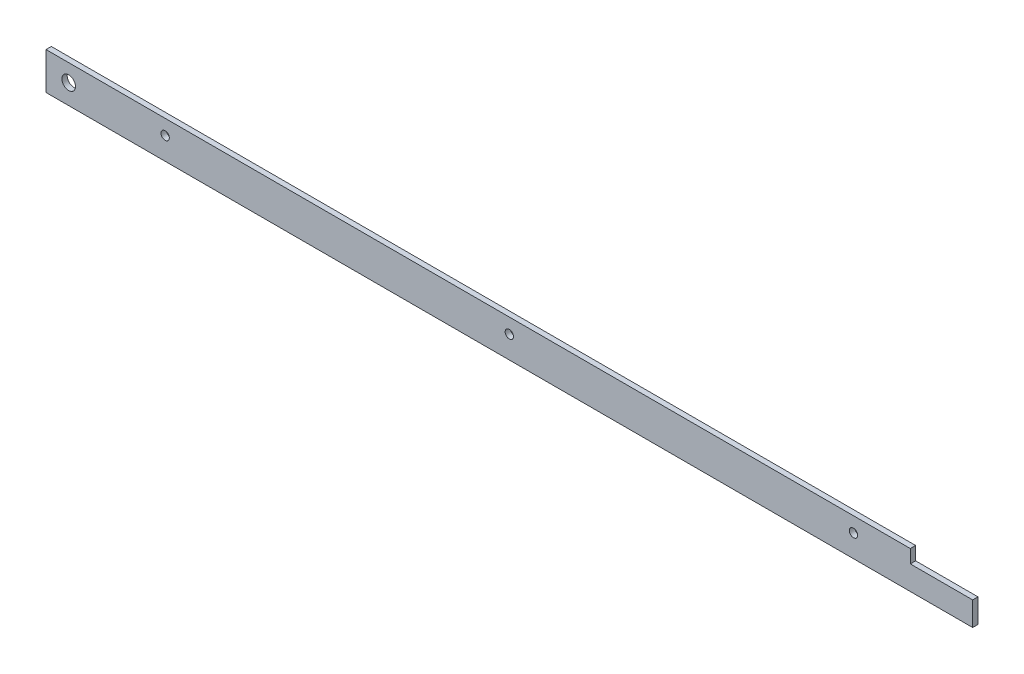
ISO-10303-21;
HEADER;
FILE_DESCRIPTION(('STEP AP214'),'2;1');
FILE_NAME('part.step','',(''),(''),'','','');
FILE_SCHEMA(('AUTOMOTIVE_DESIGN { 1 0 10303 214 1 1 1 1 }'));
ENDSEC;
DATA;
#1=APPLICATION_CONTEXT('core data for automotive mechanical design processes');
#2=APPLICATION_PROTOCOL_DEFINITION('international standard','automotive_design',2000,#1);
#3=PRODUCT_CONTEXT('',#1,'mechanical');
#4=PRODUCT('Part','Part','',(#3));
#5=PRODUCT_RELATED_PRODUCT_CATEGORY('part','',(#4));
#6=PRODUCT_DEFINITION_FORMATION('','',#4);
#7=PRODUCT_DEFINITION_CONTEXT('part definition',#1,'design');
#8=PRODUCT_DEFINITION('design','',#6,#7);
#9=PRODUCT_DEFINITION_SHAPE('','',#8);
#10=(LENGTH_UNIT() NAMED_UNIT(*) SI_UNIT(.MILLI.,.METRE.));
#11=(NAMED_UNIT(*) PLANE_ANGLE_UNIT() SI_UNIT($,.RADIAN.));
#12=(NAMED_UNIT(*) SI_UNIT($,.STERADIAN.) SOLID_ANGLE_UNIT());
#13=UNCERTAINTY_MEASURE_WITH_UNIT(LENGTH_MEASURE(1.E-05),#10,'distance_accuracy_value','');
#14=(GEOMETRIC_REPRESENTATION_CONTEXT(3) GLOBAL_UNCERTAINTY_ASSIGNED_CONTEXT((#13)) GLOBAL_UNIT_ASSIGNED_CONTEXT((#10,
#11,#12)) REPRESENTATION_CONTEXT('',''));
#15=CARTESIAN_POINT('',(0.,0.,0.));
#16=DIRECTION('',(0.,0.,1.));
#17=DIRECTION('',(1.,0.,0.));
#18=AXIS2_PLACEMENT_3D('',#15,#16,#17);
#19=CARTESIAN_POINT('',(0.,9.44698802890072,-3.175));
#20=DIRECTION('',(0.,1.,0.));
#21=DIRECTION('',(0.,0.,-1.));
#22=AXIS2_PLACEMENT_3D('',#19,#20,#21);
#23=PLANE('',#22);
#24=DIRECTION('',(1.,0.,0.));
#25=VECTOR('',#24,1.);
#26=CARTESIAN_POINT('',(0.,9.44698802890072,0.));
#27=LINE('',#26,#25);
#28=CARTESIAN_POINT('',(515.860000058,9.44698802890072,0.));
#29=VERTEX_POINT('',#28);
#30=CARTESIAN_POINT('',(553.1,9.44698802890072,0.));
#31=VERTEX_POINT('',#30);
#32=EDGE_CURVE('E139',#29,#31,#27,.T.);
#33=ORIENTED_EDGE('',*,*,#32,.T.);
#34=DIRECTION('',(0.,0.,1.));
#35=VECTOR('',#34,1.);
#36=CARTESIAN_POINT('',(553.1,9.44698802890072,-3.175));
#37=LINE('',#36,#35);
#38=CARTESIAN_POINT('',(553.1,9.44698802890072,-3.175));
#39=VERTEX_POINT('',#38);
#40=EDGE_CURVE('E138',#39,#31,#37,.T.);
#41=ORIENTED_EDGE('',*,*,#40,.F.);
#42=DIRECTION('',(1.,0.,0.));
#43=VECTOR('',#42,1.);
#44=CARTESIAN_POINT('',(0.,9.44698802890072,-3.175));
#45=LINE('',#44,#43);
#46=CARTESIAN_POINT('',(515.860000058,9.44698802890072,-3.175));
#47=VERTEX_POINT('',#46);
#48=EDGE_CURVE('E164',#47,#39,#45,.T.);
#49=ORIENTED_EDGE('',*,*,#48,.F.);
#50=DIRECTION('',(0.,0.,1.));
#51=VECTOR('',#50,1.);
#52=CARTESIAN_POINT('',(515.860000058,9.44698802890072,-3.175));
#53=LINE('',#52,#51);
#54=EDGE_CURVE('E11',#47,#29,#53,.T.);
#55=ORIENTED_EDGE('',*,*,#54,.T.);
#56=EDGE_LOOP('',(#33,#41,#49,#55));
#57=FACE_BOUND('',#56,.T.);
#58=ADVANCED_FACE('F43',(#57),#23,.T.);
#59=CARTESIAN_POINT('',(515.860000058,0.,-3.175));
#60=DIRECTION('',(-1.,0.,0.));
#61=DIRECTION('',(0.,0.,-1.));
#62=AXIS2_PLACEMENT_3D('',#59,#60,#61);
#63=PLANE('',#62);
#64=DIRECTION('',(0.,1.,0.));
#65=VECTOR('',#64,1.);
#66=CARTESIAN_POINT('',(515.860000058,0.,0.));
#67=LINE('',#66,#65);
#68=CARTESIAN_POINT('',(515.860000058,17.3919880289007,0.));
#69=VERTEX_POINT('',#68);
#70=EDGE_CURVE('E142',#29,#69,#67,.T.);
#71=ORIENTED_EDGE('',*,*,#70,.F.);
#72=ORIENTED_EDGE('',*,*,#54,.F.);
#73=DIRECTION('',(0.,1.,0.));
#74=VECTOR('',#73,1.);
#75=CARTESIAN_POINT('',(515.860000058,0.,-3.175));
#76=LINE('',#75,#74);
#77=CARTESIAN_POINT('',(515.860000058,17.3919880289007,-3.175));
#78=VERTEX_POINT('',#77);
#79=EDGE_CURVE('E91',#47,#78,#76,.T.);
#80=ORIENTED_EDGE('',*,*,#79,.T.);
#81=DIRECTION('',(0.,0.,1.));
#82=VECTOR('',#81,1.);
#83=CARTESIAN_POINT('',(515.860000058,17.3919880289007,-3.175));
#84=LINE('',#83,#82);
#85=EDGE_CURVE('E51',#78,#69,#84,.T.);
#86=ORIENTED_EDGE('',*,*,#85,.T.);
#87=EDGE_LOOP('',(#71,#72,#80,#86));
#88=FACE_BOUND('',#87,.T.);
#89=ADVANCED_FACE('F170',(#88),#63,.F.);
#90=CARTESIAN_POINT('',(0.,17.3919880289006,-3.175));
#91=DIRECTION('',(0.,-1.,0.));
#92=DIRECTION('',(1.,0.,0.));
#93=AXIS2_PLACEMENT_3D('',#90,#91,#92);
#94=PLANE('',#93);
#95=DIRECTION('',(-1.,0.,0.));
#96=VECTOR('',#95,1.);
#97=CARTESIAN_POINT('',(0.,17.3919880289006,0.));
#98=LINE('',#97,#96);
#99=CARTESIAN_POINT('',(0.,17.3919880289006,0.));
#100=VERTEX_POINT('',#99);
#101=EDGE_CURVE('E145',#69,#100,#98,.T.);
#102=ORIENTED_EDGE('',*,*,#101,.F.);
#103=ORIENTED_EDGE('',*,*,#85,.F.);
#104=DIRECTION('',(-1.,0.,0.));
#105=VECTOR('',#104,1.);
#106=CARTESIAN_POINT('',(0.,17.3919880289006,-3.175));
#107=LINE('',#106,#105);
#108=CARTESIAN_POINT('',(0.,17.3919880289006,-3.175));
#109=VERTEX_POINT('',#108);
#110=EDGE_CURVE('E120',#78,#109,#107,.T.);
#111=ORIENTED_EDGE('',*,*,#110,.T.);
#112=DIRECTION('',(0.,0.,1.));
#113=VECTOR('',#112,1.);
#114=CARTESIAN_POINT('',(0.,17.3919880289006,-3.175));
#115=LINE('',#114,#113);
#116=EDGE_CURVE('E114',#109,#100,#115,.T.);
#117=ORIENTED_EDGE('',*,*,#116,.T.);
#118=EDGE_LOOP('',(#102,#103,#111,#117));
#119=FACE_BOUND('',#118,.T.);
#120=ADVANCED_FACE('F197',(#119),#94,.F.);
#121=CARTESIAN_POINT('',(0.,0.,-3.175));
#122=DIRECTION('',(-1.,0.,0.));
#123=DIRECTION('',(0.,0.,-1.));
#124=AXIS2_PLACEMENT_3D('',#121,#122,#123);
#125=PLANE('',#124);
#126=DIRECTION('',(0.,1.,0.));
#127=VECTOR('',#126,1.);
#128=CARTESIAN_POINT('',(0.,0.,0.));
#129=LINE('',#128,#127);
#130=CARTESIAN_POINT('',(0.,-4.83301197109929,0.));
#131=VERTEX_POINT('',#130);
#132=EDGE_CURVE('E148',#131,#100,#129,.T.);
#133=ORIENTED_EDGE('',*,*,#132,.T.);
#134=ORIENTED_EDGE('',*,*,#116,.F.);
#135=DIRECTION('',(0.,1.,0.));
#136=VECTOR('',#135,1.);
#137=CARTESIAN_POINT('',(0.,0.,-3.175));
#138=LINE('',#137,#136);
#139=CARTESIAN_POINT('',(0.,-4.83301197109929,-3.175));
#140=VERTEX_POINT('',#139);
#141=EDGE_CURVE('E104',#140,#109,#138,.T.);
#142=ORIENTED_EDGE('',*,*,#141,.F.);
#143=DIRECTION('',(0.,0.,1.));
#144=VECTOR('',#143,1.);
#145=CARTESIAN_POINT('',(0.,-4.83301197109929,-3.175));
#146=LINE('',#145,#144);
#147=EDGE_CURVE('E109',#140,#131,#146,.T.);
#148=ORIENTED_EDGE('',*,*,#147,.T.);
#149=EDGE_LOOP('',(#133,#134,#142,#148));
#150=FACE_BOUND('',#149,.T.);
#151=ADVANCED_FACE('F117',(#150),#125,.T.);
#152=CARTESIAN_POINT('',(0.,-4.83301197109929,-3.175));
#153=DIRECTION('',(0.,1.,0.));
#154=DIRECTION('',(0.,0.,-1.));
#155=AXIS2_PLACEMENT_3D('',#152,#153,#154);
#156=PLANE('',#155);
#157=DIRECTION('',(1.,0.,0.));
#158=VECTOR('',#157,1.);
#159=CARTESIAN_POINT('',(0.,-4.83301197109929,0.));
#160=LINE('',#159,#158);
#161=CARTESIAN_POINT('',(553.1,-4.83301197109929,0.));
#162=VERTEX_POINT('',#161);
#163=EDGE_CURVE('E111',#131,#162,#160,.T.);
#164=ORIENTED_EDGE('',*,*,#163,.F.);
#165=ORIENTED_EDGE('',*,*,#147,.F.);
#166=DIRECTION('',(1.,0.,0.));
#167=VECTOR('',#166,1.);
#168=CARTESIAN_POINT('',(0.,-4.83301197109929,-3.175));
#169=LINE('',#168,#167);
#170=CARTESIAN_POINT('',(553.1,-4.83301197109929,-3.175));
#171=VERTEX_POINT('',#170);
#172=EDGE_CURVE('E99',#140,#171,#169,.T.);
#173=ORIENTED_EDGE('',*,*,#172,.T.);
#174=DIRECTION('',(0.,0.,1.));
#175=VECTOR('',#174,1.);
#176=CARTESIAN_POINT('',(553.1,-4.83301197109929,-3.175));
#177=LINE('',#176,#175);
#178=EDGE_CURVE('E115',#171,#162,#177,.T.);
#179=ORIENTED_EDGE('',*,*,#178,.T.);
#180=EDGE_LOOP('',(#164,#165,#173,#179));
#181=FACE_BOUND('',#180,.T.);
#182=ADVANCED_FACE('F110',(#181),#156,.F.);
#183=CARTESIAN_POINT('',(481.98,8.5094880289007,-3.175));
#184=DIRECTION('',(0.,0.,1.));
#185=DIRECTION('',(-1.,0.,0.));
#186=AXIS2_PLACEMENT_3D('',#183,#184,#185);
#187=CYLINDRICAL_SURFACE('',#186,2.48920000000001);
#188=CARTESIAN_POINT('',(481.98,8.5094880289007,-3.175));
#189=DIRECTION('',(0.,0.,1.));
#190=DIRECTION('',(1.,0.,0.));
#191=AXIS2_PLACEMENT_3D('',#188,#189,#190);
#192=CIRCLE('',#191,2.48920000000001);
#193=CARTESIAN_POINT('',(484.4692,8.5094880289007,-3.175));
#194=VERTEX_POINT('',#193);
#195=EDGE_CURVE('E132',#194,#194,#192,.T.);
#196=ORIENTED_EDGE('',*,*,#195,.F.);
#197=EDGE_LOOP('',(#196));
#198=FACE_BOUND('',#197,.T.);
#199=CARTESIAN_POINT('',(481.98,8.5094880289007,0.));
#200=DIRECTION('',(0.,0.,1.));
#201=DIRECTION('',(1.,0.,0.));
#202=AXIS2_PLACEMENT_3D('',#199,#200,#201);
#203=CIRCLE('',#202,2.48920000000001);
#204=CARTESIAN_POINT('',(484.4692,8.5094880289007,0.));
#205=VERTEX_POINT('',#204);
#206=EDGE_CURVE('E158',#205,#205,#203,.T.);
#207=ORIENTED_EDGE('',*,*,#206,.T.);
#208=EDGE_LOOP('',(#207));
#209=FACE_BOUND('',#208,.T.);
#210=ADVANCED_FACE('F205',(#198,#209),#187,.F.);
#211=CARTESIAN_POINT('',(276.55,8.5094880289007,-3.175));
#212=DIRECTION('',(0.,0.,1.));
#213=DIRECTION('',(-1.,0.,0.));
#214=AXIS2_PLACEMENT_3D('',#211,#212,#213);
#215=CYLINDRICAL_SURFACE('',#214,2.48920000000001);
#216=CARTESIAN_POINT('',(276.55,8.5094880289007,-3.175));
#217=DIRECTION('',(0.,0.,1.));
#218=DIRECTION('',(1.,0.,0.));
#219=AXIS2_PLACEMENT_3D('',#216,#217,#218);
#220=CIRCLE('',#219,2.48920000000001);
#221=CARTESIAN_POINT('',(279.0392,8.5094880289007,-3.175));
#222=VERTEX_POINT('',#221);
#223=EDGE_CURVE('E129',#222,#222,#220,.T.);
#224=ORIENTED_EDGE('',*,*,#223,.F.);
#225=EDGE_LOOP('',(#224));
#226=FACE_BOUND('',#225,.T.);
#227=CARTESIAN_POINT('',(276.55,8.5094880289007,0.));
#228=DIRECTION('',(0.,0.,1.));
#229=DIRECTION('',(1.,0.,0.));
#230=AXIS2_PLACEMENT_3D('',#227,#228,#229);
#231=CIRCLE('',#230,2.48920000000001);
#232=CARTESIAN_POINT('',(279.0392,8.5094880289007,0.));
#233=VERTEX_POINT('',#232);
#234=EDGE_CURVE('E155',#233,#233,#231,.T.);
#235=ORIENTED_EDGE('',*,*,#234,.T.);
#236=EDGE_LOOP('',(#235));
#237=FACE_BOUND('',#236,.T.);
#238=ADVANCED_FACE('F189',(#226,#237),#215,.F.);
#239=CARTESIAN_POINT('',(71.12,8.5094880289007,-3.175));
#240=DIRECTION('',(0.,0.,1.));
#241=DIRECTION('',(-1.,0.,0.));
#242=AXIS2_PLACEMENT_3D('',#239,#240,#241);
#243=CYLINDRICAL_SURFACE('',#242,2.4892);
#244=CARTESIAN_POINT('',(71.12,8.5094880289007,-3.175));
#245=DIRECTION('',(0.,0.,1.));
#246=DIRECTION('',(1.,0.,0.));
#247=AXIS2_PLACEMENT_3D('',#244,#245,#246);
#248=CIRCLE('',#247,2.4892);
#249=CARTESIAN_POINT('',(73.6092,8.5094880289007,-3.175));
#250=VERTEX_POINT('',#249);
#251=EDGE_CURVE('E126',#250,#250,#248,.T.);
#252=ORIENTED_EDGE('',*,*,#251,.F.);
#253=EDGE_LOOP('',(#252));
#254=FACE_BOUND('',#253,.T.);
#255=CARTESIAN_POINT('',(71.12,8.5094880289007,0.));
#256=DIRECTION('',(0.,0.,1.));
#257=DIRECTION('',(1.,0.,0.));
#258=AXIS2_PLACEMENT_3D('',#255,#256,#257);
#259=CIRCLE('',#258,2.4892);
#260=CARTESIAN_POINT('',(73.6092,8.5094880289007,0.));
#261=VERTEX_POINT('',#260);
#262=EDGE_CURVE('E152',#261,#261,#259,.T.);
#263=ORIENTED_EDGE('',*,*,#262,.T.);
#264=EDGE_LOOP('',(#263));
#265=FACE_BOUND('',#264,.T.);
#266=ADVANCED_FACE('F181',(#254,#265),#243,.F.);
#267=CARTESIAN_POINT('',(553.1,0.,-3.175));
#268=DIRECTION('',(1.,0.,0.));
#269=DIRECTION('',(0.,0.,1.));
#270=AXIS2_PLACEMENT_3D('',#267,#268,#269);
#271=PLANE('',#270);
#272=DIRECTION('',(0.,-1.,0.));
#273=VECTOR('',#272,1.);
#274=CARTESIAN_POINT('',(553.1,0.,0.));
#275=LINE('',#274,#273);
#276=EDGE_CURVE('E79',#31,#162,#275,.T.);
#277=ORIENTED_EDGE('',*,*,#276,.T.);
#278=ORIENTED_EDGE('',*,*,#178,.F.);
#279=DIRECTION('',(0.,-1.,0.));
#280=VECTOR('',#279,1.);
#281=CARTESIAN_POINT('',(553.1,0.,-3.175));
#282=LINE('',#281,#280);
#283=EDGE_CURVE('E59',#39,#171,#282,.T.);
#284=ORIENTED_EDGE('',*,*,#283,.F.);
#285=ORIENTED_EDGE('',*,*,#40,.T.);
#286=EDGE_LOOP('',(#277,#278,#284,#285));
#287=FACE_BOUND('',#286,.T.);
#288=ADVANCED_FACE('F178',(#287),#271,.T.);
#289=CARTESIAN_POINT('',(13.54,7.02698802890071,-3.175));
#290=DIRECTION('',(0.,0.,1.));
#291=DIRECTION('',(-1.,0.,0.));
#292=AXIS2_PLACEMENT_3D('',#289,#290,#291);
#293=CYLINDRICAL_SURFACE('',#292,4.0635);
#294=CARTESIAN_POINT('',(13.54,7.02698802890071,-3.175));
#295=DIRECTION('',(0.,0.,1.));
#296=DIRECTION('',(1.,0.,0.));
#297=AXIS2_PLACEMENT_3D('',#294,#295,#296);
#298=CIRCLE('',#297,4.0635);
#299=CARTESIAN_POINT('',(17.6035,7.02698802890071,-3.175));
#300=VERTEX_POINT('',#299);
#301=EDGE_CURVE('E135',#300,#300,#298,.F.);
#302=ORIENTED_EDGE('',*,*,#301,.T.);
#303=EDGE_LOOP('',(#302));
#304=FACE_BOUND('',#303,.T.);
#305=CARTESIAN_POINT('',(13.54,7.02698802890071,0.));
#306=DIRECTION('',(0.,0.,1.));
#307=DIRECTION('',(1.,0.,0.));
#308=AXIS2_PLACEMENT_3D('',#305,#306,#307);
#309=CIRCLE('',#308,4.0635);
#310=CARTESIAN_POINT('',(17.6035,7.02698802890071,0.));
#311=VERTEX_POINT('',#310);
#312=EDGE_CURVE('E161',#311,#311,#309,.F.);
#313=ORIENTED_EDGE('',*,*,#312,.F.);
#314=EDGE_LOOP('',(#313));
#315=FACE_BOUND('',#314,.T.);
#316=ADVANCED_FACE('F180',(#304,#315),#293,.F.);
#317=CARTESIAN_POINT('',(0.,0.,-3.175));
#318=DIRECTION('',(0.,0.,-1.));
#319=DIRECTION('',(1.,0.,0.));
#320=AXIS2_PLACEMENT_3D('',#317,#318,#319);
#321=PLANE('',#320);
#322=ORIENTED_EDGE('',*,*,#48,.T.);
#323=ORIENTED_EDGE('',*,*,#283,.T.);
#324=ORIENTED_EDGE('',*,*,#172,.F.);
#325=ORIENTED_EDGE('',*,*,#141,.T.);
#326=ORIENTED_EDGE('',*,*,#110,.F.);
#327=ORIENTED_EDGE('',*,*,#79,.F.);
#328=EDGE_LOOP('',(#322,#323,#324,#325,#326,#327));
#329=FACE_BOUND('',#328,.T.);
#330=ORIENTED_EDGE('',*,*,#251,.T.);
#331=EDGE_LOOP('',(#330));
#332=FACE_BOUND('',#331,.T.);
#333=ORIENTED_EDGE('',*,*,#223,.T.);
#334=EDGE_LOOP('',(#333));
#335=FACE_BOUND('',#334,.T.);
#336=ORIENTED_EDGE('',*,*,#195,.T.);
#337=EDGE_LOOP('',(#336));
#338=FACE_BOUND('',#337,.T.);
#339=ORIENTED_EDGE('',*,*,#301,.F.);
#340=EDGE_LOOP('',(#339));
#341=FACE_BOUND('',#340,.T.);
#342=ADVANCED_FACE('F101',(#329,#332,#335,#338,#341),#321,.T.);
#343=CARTESIAN_POINT('',(0.,0.,0.));
#344=DIRECTION('',(0.,0.,-1.));
#345=DIRECTION('',(1.,0.,0.));
#346=AXIS2_PLACEMENT_3D('',#343,#344,#345);
#347=PLANE('',#346);
#348=ORIENTED_EDGE('',*,*,#32,.F.);
#349=ORIENTED_EDGE('',*,*,#70,.T.);
#350=ORIENTED_EDGE('',*,*,#101,.T.);
#351=ORIENTED_EDGE('',*,*,#132,.F.);
#352=ORIENTED_EDGE('',*,*,#163,.T.);
#353=ORIENTED_EDGE('',*,*,#276,.F.);
#354=EDGE_LOOP('',(#348,#349,#350,#351,#352,#353));
#355=FACE_BOUND('',#354,.T.);
#356=ORIENTED_EDGE('',*,*,#262,.F.);
#357=EDGE_LOOP('',(#356));
#358=FACE_BOUND('',#357,.T.);
#359=ORIENTED_EDGE('',*,*,#234,.F.);
#360=EDGE_LOOP('',(#359));
#361=FACE_BOUND('',#360,.T.);
#362=ORIENTED_EDGE('',*,*,#206,.F.);
#363=EDGE_LOOP('',(#362));
#364=FACE_BOUND('',#363,.T.);
#365=ORIENTED_EDGE('',*,*,#312,.T.);
#366=EDGE_LOOP('',(#365));
#367=FACE_BOUND('',#366,.T.);
#368=ADVANCED_FACE('F172',(#355,#358,#361,#364,#367),#347,.F.);
#369=CLOSED_SHELL('',(#58,#89,#120,#151,#182,#210,#238,#266,#288,#316,#342,#368));
#370=MANIFOLD_SOLID_BREP('B2',#369);
#371=ADVANCED_BREP_SHAPE_REPRESENTATION('',(#18,#370),#14);
#372=SHAPE_DEFINITION_REPRESENTATION(#9,#371);
ENDSEC;
END-ISO-10303-21;
